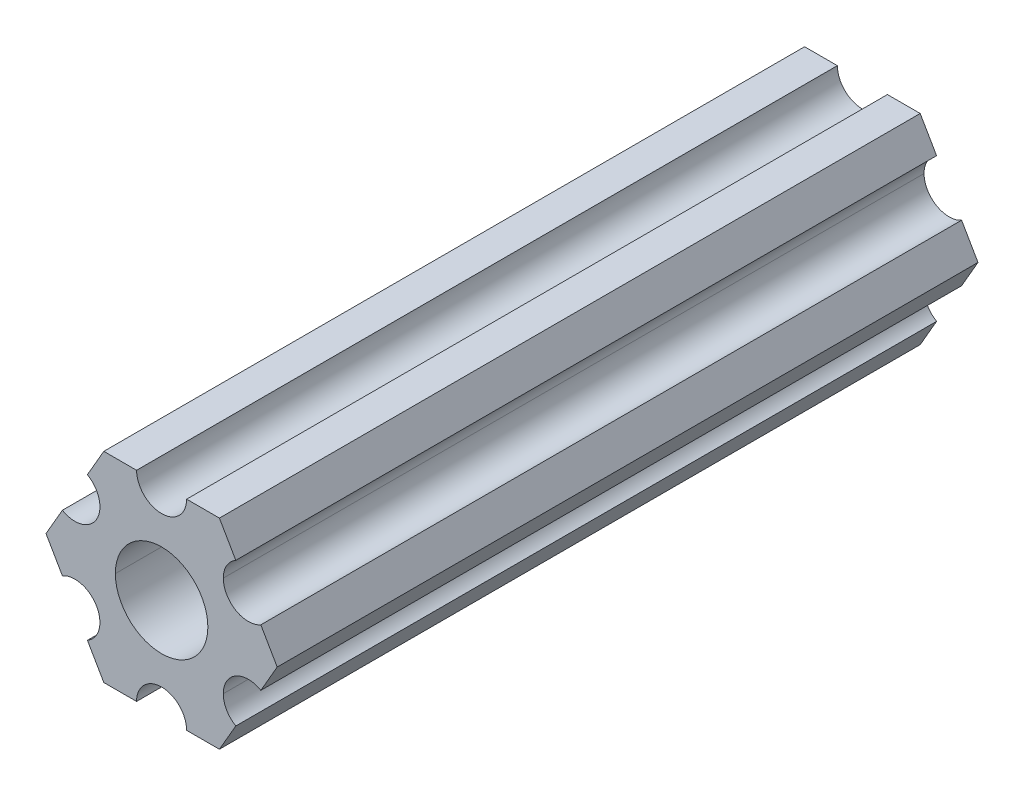
ISO-10303-21;
HEADER;
FILE_DESCRIPTION(('STEP AP214'),'2;1');
FILE_NAME('part.step','',(''),(''),'','','');
FILE_SCHEMA(('AUTOMOTIVE_DESIGN { 1 0 10303 214 1 1 1 1 }'));
ENDSEC;
DATA;
#1=APPLICATION_CONTEXT('core data for automotive mechanical design processes');
#2=APPLICATION_PROTOCOL_DEFINITION('international standard','automotive_design',2000,#1);
#3=PRODUCT_CONTEXT('',#1,'mechanical');
#4=PRODUCT('Part','Part','',(#3));
#5=PRODUCT_RELATED_PRODUCT_CATEGORY('part','',(#4));
#6=PRODUCT_DEFINITION_FORMATION('','',#4);
#7=PRODUCT_DEFINITION_CONTEXT('part definition',#1,'design');
#8=PRODUCT_DEFINITION('design','',#6,#7);
#9=PRODUCT_DEFINITION_SHAPE('','',#8);
#10=(LENGTH_UNIT() NAMED_UNIT(*) SI_UNIT(.MILLI.,.METRE.));
#11=(NAMED_UNIT(*) PLANE_ANGLE_UNIT() SI_UNIT($,.RADIAN.));
#12=(NAMED_UNIT(*) SI_UNIT($,.STERADIAN.) SOLID_ANGLE_UNIT());
#13=UNCERTAINTY_MEASURE_WITH_UNIT(LENGTH_MEASURE(1.E-05),#10,'distance_accuracy_value','');
#14=(GEOMETRIC_REPRESENTATION_CONTEXT(3) GLOBAL_UNCERTAINTY_ASSIGNED_CONTEXT((#13)) GLOBAL_UNIT_ASSIGNED_CONTEXT((#10,
#11,#12)) REPRESENTATION_CONTEXT('',''));
#15=CARTESIAN_POINT('',(0.,0.,0.));
#16=DIRECTION('',(0.,0.,1.));
#17=DIRECTION('',(1.,0.,0.));
#18=AXIS2_PLACEMENT_3D('',#15,#16,#17);
#19=CARTESIAN_POINT('',(6.29301142309098,-1.80018429024546,85.725));
#20=DIRECTION('',(-0.866025434075723,0.499999947533953,0.));
#21=DIRECTION('',(0.,0.,1.));
#22=AXIS2_PLACEMENT_3D('',#19,#20,#21);
#23=PLANE('',#22);
#24=DIRECTION('',(0.499999947533953,0.866025434075723,0.));
#25=VECTOR('',#24,1.);
#26=CARTESIAN_POINT('',(6.29301142309098,-1.80018429024546,44.45));
#27=LINE('',#26,#25);
#28=CARTESIAN_POINT('',(6.29301142309098,-1.80018429024546,44.45));
#29=VERTEX_POINT('',#28);
#30=CARTESIAN_POINT('',(7.33234841870826,4.44212519415746E-07,44.45));
#31=VERTEX_POINT('',#30);
#32=EDGE_CURVE('E398',#29,#31,#27,.T.);
#33=ORIENTED_EDGE('',*,*,#32,.F.);
#34=DIRECTION('',(0.,0.,-1.));
#35=VECTOR('',#34,1.);
#36=CARTESIAN_POINT('',(6.29301142309098,-1.80018429024546,85.725));
#37=LINE('',#36,#35);
#38=CARTESIAN_POINT('',(6.29301142309098,-1.80018429024546,0.));
#39=VERTEX_POINT('',#38);
#40=EDGE_CURVE('E270',#29,#39,#37,.T.);
#41=ORIENTED_EDGE('',*,*,#40,.T.);
#42=DIRECTION('',(0.499999947533953,0.866025434075723,0.));
#43=VECTOR('',#42,1.);
#44=CARTESIAN_POINT('',(6.29301142309098,-1.80018429024546,0.));
#45=LINE('',#44,#43);
#46=CARTESIAN_POINT('',(7.33234841870826,4.44212518961143E-07,0.));
#47=VERTEX_POINT('',#46);
#48=EDGE_CURVE('E292',#39,#47,#45,.T.);
#49=ORIENTED_EDGE('',*,*,#48,.T.);
#50=DIRECTION('',(0.,0.,1.));
#51=VECTOR('',#50,1.);
#52=CARTESIAN_POINT('',(7.33234841870827,4.44212519169686E-07,85.725));
#53=LINE('',#52,#51);
#54=EDGE_CURVE('E65',#47,#31,#53,.T.);
#55=ORIENTED_EDGE('',*,*,#54,.T.);
#56=EDGE_LOOP('',(#33,#41,#49,#55));
#57=FACE_BOUND('',#56,.T.);
#58=ADVANCED_FACE('F57',(#57),#23,.F.);
#59=CARTESIAN_POINT('',(7.33234841870827,4.44212519169686E-07,85.725));
#60=DIRECTION('',(-0.866025373493145,-0.500000052466057,0.));
#61=DIRECTION('',(-0.500000052466057,0.866025373493145,0.));
#62=AXIS2_PLACEMENT_3D('',#59,#60,#61);
#63=PLANE('',#62);
#64=DIRECTION('',(-0.500000052466057,0.866025373493145,0.));
#65=VECTOR('',#64,1.);
#66=CARTESIAN_POINT('',(7.33234841870827,4.44212519169686E-07,44.45));
#67=LINE('',#66,#65);
#68=CARTESIAN_POINT('',(6.29301120497139,1.80018505273895,44.45));
#69=VERTEX_POINT('',#68);
#70=EDGE_CURVE('E406',#31,#69,#67,.T.);
#71=ORIENTED_EDGE('',*,*,#70,.F.);
#72=ORIENTED_EDGE('',*,*,#54,.F.);
#73=DIRECTION('',(-0.500000052466057,0.866025373493145,0.));
#74=VECTOR('',#73,1.);
#75=CARTESIAN_POINT('',(7.33234841870827,4.44212519198906E-07,0.));
#76=LINE('',#75,#74);
#77=CARTESIAN_POINT('',(6.29301120497139,1.80018505273894,0.));
#78=VERTEX_POINT('',#77);
#79=EDGE_CURVE('E288',#47,#78,#76,.T.);
#80=ORIENTED_EDGE('',*,*,#79,.T.);
#81=DIRECTION('',(0.,0.,1.));
#82=VECTOR('',#81,1.);
#83=CARTESIAN_POINT('',(6.29301120497139,1.80018505273894,85.725));
#84=LINE('',#83,#82);
#85=EDGE_CURVE('E390',#78,#69,#84,.T.);
#86=ORIENTED_EDGE('',*,*,#85,.T.);
#87=EDGE_LOOP('',(#71,#72,#80,#86));
#88=FACE_BOUND('',#87,.T.);
#89=ADVANCED_FACE('F404',(#88),#63,.F.);
#90=CARTESIAN_POINT('',(5.49926112168156,3.17500033315934,85.725));
#91=DIRECTION('',(0.,0.,-1.));
#92=DIRECTION('',(-1.,0.,0.));
#93=AXIS2_PLACEMENT_3D('',#90,#91,#92);
#94=CYLINDRICAL_SURFACE('',#93,1.5875);
#95=CARTESIAN_POINT('',(5.49926112168156,3.17500033315934,44.45));
#96=DIRECTION('',(0.,0.,1.));
#97=DIRECTION('',(1.,0.,0.));
#98=AXIS2_PLACEMENT_3D('',#95,#96,#97);
#99=CIRCLE('',#98,1.5875);
#100=CARTESIAN_POINT('',(3.91176112168156,3.17500033315934,44.45));
#101=VERTEX_POINT('',#100);
#102=EDGE_CURVE('E409',#69,#101,#99,.F.);
#103=ORIENTED_EDGE('',*,*,#102,.F.);
#104=ORIENTED_EDGE('',*,*,#85,.F.);
#105=CARTESIAN_POINT('',(5.49926112168156,3.17500033315934,0.));
#106=DIRECTION('',(0.,0.,-1.));
#107=DIRECTION('',(-1.,0.,0.));
#108=AXIS2_PLACEMENT_3D('',#105,#106,#107);
#109=CIRCLE('',#108,1.5875);
#110=CARTESIAN_POINT('',(3.91176112168156,3.17500033315934,0.));
#111=VERTEX_POINT('',#110);
#112=EDGE_CURVE('E262',#78,#111,#109,.T.);
#113=ORIENTED_EDGE('',*,*,#112,.T.);
#114=DIRECTION('',(0.,0.,-1.));
#115=VECTOR('',#114,1.);
#116=CARTESIAN_POINT('',(3.91176112168156,3.17500033315934,85.725));
#117=LINE('',#116,#115);
#118=EDGE_CURVE('E273',#101,#111,#117,.T.);
#119=ORIENTED_EDGE('',*,*,#118,.F.);
#120=EDGE_LOOP('',(#103,#104,#113,#119));
#121=FACE_BOUND('',#120,.T.);
#122=ADVANCED_FACE('F869',(#121),#94,.F.);
#123=CARTESIAN_POINT('',(4.70551103839172,4.54981561357972,85.725));
#124=DIRECTION('',(-0.866025373493151,-0.500000052466046,0.));
#125=DIRECTION('',(-0.500000052466046,0.866025373493151,0.));
#126=AXIS2_PLACEMENT_3D('',#123,#124,#125);
#127=PLANE('',#126);
#128=DIRECTION('',(-0.500000052466046,0.866025373493151,0.));
#129=VECTOR('',#128,1.);
#130=CARTESIAN_POINT('',(4.70551103839172,4.54981561357972,44.45));
#131=LINE('',#130,#129);
#132=CARTESIAN_POINT('',(4.70551103839172,4.54981561357972,44.45));
#133=VERTEX_POINT('',#132);
#134=CARTESIAN_POINT('',(3.66617382465481,6.35000022210627,44.45));
#135=VERTEX_POINT('',#134);
#136=EDGE_CURVE('E479',#133,#135,#131,.T.);
#137=ORIENTED_EDGE('',*,*,#136,.F.);
#138=DIRECTION('',(0.,0.,1.));
#139=VECTOR('',#138,1.);
#140=CARTESIAN_POINT('',(4.70551103839172,4.54981561357972,85.725));
#141=LINE('',#140,#139);
#142=CARTESIAN_POINT('',(4.70551103839172,4.54981561357972,0.));
#143=VERTEX_POINT('',#142);
#144=EDGE_CURVE('E281',#143,#133,#141,.T.);
#145=ORIENTED_EDGE('',*,*,#144,.F.);
#146=DIRECTION('',(-0.500000052466046,0.866025373493151,0.));
#147=VECTOR('',#146,1.);
#148=CARTESIAN_POINT('',(4.70551103839172,4.54981561357972,0.));
#149=LINE('',#148,#147);
#150=CARTESIAN_POINT('',(3.66617382465481,6.35000022210627,0.));
#151=VERTEX_POINT('',#150);
#152=EDGE_CURVE('E259',#143,#151,#149,.T.);
#153=ORIENTED_EDGE('',*,*,#152,.T.);
#154=DIRECTION('',(0.,0.,1.));
#155=VECTOR('',#154,1.);
#156=CARTESIAN_POINT('',(3.66617382465481,6.35000022210627,85.725));
#157=LINE('',#156,#155);
#158=EDGE_CURVE('E386',#151,#135,#157,.T.);
#159=ORIENTED_EDGE('',*,*,#158,.T.);
#160=EDGE_LOOP('',(#137,#145,#153,#159));
#161=FACE_BOUND('',#160,.T.);
#162=ADVANCED_FACE('F491',(#161),#127,.F.);
#163=CARTESIAN_POINT('',(3.66617382465481,6.35000022210627,85.725));
#164=DIRECTION('',(6.05825850611185E-08,-1.,0.));
#165=DIRECTION('',(0.,0.,-1.));
#166=AXIS2_PLACEMENT_3D('',#163,#164,#165);
#167=PLANE('',#166);
#168=DIRECTION('',(-0.999999999999998,-6.05825850611184E-08,0.));
#169=VECTOR('',#168,1.);
#170=CARTESIAN_POINT('',(3.66617382465481,6.35000022210627,44.45));
#171=LINE('',#170,#169);
#172=CARTESIAN_POINT('',(1.58749961530074,6.35,44.45));
#173=VERTEX_POINT('',#172);
#174=EDGE_CURVE('E476',#135,#173,#171,.T.);
#175=ORIENTED_EDGE('',*,*,#174,.F.);
#176=ORIENTED_EDGE('',*,*,#158,.F.);
#177=DIRECTION('',(-1.,0.,0.));
#178=VECTOR('',#177,1.);
#179=CARTESIAN_POINT('',(5.49926112168156,6.35000022210627,0.));
#180=LINE('',#179,#178);
#181=CARTESIAN_POINT('',(1.58749961530073,6.35000015914054,0.));
#182=VERTEX_POINT('',#181);
#183=EDGE_CURVE('E263',#151,#182,#180,.T.);
#184=ORIENTED_EDGE('',*,*,#183,.T.);
#185=DIRECTION('',(0.,0.,1.));
#186=VECTOR('',#185,1.);
#187=CARTESIAN_POINT('',(1.58749961530074,6.35000009617482,85.725));
#188=LINE('',#187,#186);
#189=EDGE_CURVE('E303',#182,#173,#188,.T.);
#190=ORIENTED_EDGE('',*,*,#189,.T.);
#191=EDGE_LOOP('',(#175,#176,#184,#190));
#192=FACE_BOUND('',#191,.T.);
#193=ADVANCED_FACE('F498',(#192),#167,.F.);
#194=CARTESIAN_POINT('',(-3.84699260060323E-07,6.35,85.725));
#195=DIRECTION('',(0.,0.,-1.));
#196=DIRECTION('',(-1.,0.,0.));
#197=AXIS2_PLACEMENT_3D('',#194,#195,#196);
#198=CYLINDRICAL_SURFACE('',#197,1.5875);
#199=CARTESIAN_POINT('',(-3.84699260060323E-07,6.35,44.45));
#200=DIRECTION('',(0.,0.,1.));
#201=DIRECTION('',(1.,0.,0.));
#202=AXIS2_PLACEMENT_3D('',#199,#200,#201);
#203=CIRCLE('',#202,1.5875);
#204=CARTESIAN_POINT('',(-1.58750038469926,6.34999990382518,44.45));
#205=VERTEX_POINT('',#204);
#206=EDGE_CURVE('E473',#173,#205,#203,.F.);
#207=ORIENTED_EDGE('',*,*,#206,.F.);
#208=ORIENTED_EDGE('',*,*,#189,.F.);
#209=CARTESIAN_POINT('',(-3.84699260060323E-07,6.35,0.));
#210=DIRECTION('',(0.,0.,-1.));
#211=DIRECTION('',(-1.,0.,0.));
#212=AXIS2_PLACEMENT_3D('',#209,#210,#211);
#213=CIRCLE('',#212,1.5875);
#214=CARTESIAN_POINT('',(-1.58750038469926,6.34999990382519,0.));
#215=VERTEX_POINT('',#214);
#216=EDGE_CURVE('E329',#182,#215,#213,.T.);
#217=ORIENTED_EDGE('',*,*,#216,.T.);
#218=DIRECTION('',(0.,0.,1.));
#219=VECTOR('',#218,1.);
#220=CARTESIAN_POINT('',(-1.58750038469926,6.34999990382518,85.725));
#221=LINE('',#220,#219);
#222=EDGE_CURVE('E299',#215,#205,#221,.T.);
#223=ORIENTED_EDGE('',*,*,#222,.T.);
#224=EDGE_LOOP('',(#207,#208,#217,#223));
#225=FACE_BOUND('',#224,.T.);
#226=ADVANCED_FACE('F502',(#225),#198,.F.);
#227=CARTESIAN_POINT('',(-1.58750038469926,6.34999990382518,85.725));
#228=DIRECTION('',(6.05825963273174E-08,-1.,0.));
#229=DIRECTION('',(0.,0.,-1.));
#230=AXIS2_PLACEMENT_3D('',#227,#228,#229);
#231=PLANE('',#230);
#232=DIRECTION('',(-0.999999999999998,-6.05825963273173E-08,0.));
#233=VECTOR('',#232,1.);
#234=CARTESIAN_POINT('',(-1.58750038469926,6.34999990382518,44.45));
#235=LINE('',#234,#233);
#236=CARTESIAN_POINT('',(-3.66617454558244,6.34999986184803,44.45));
#237=VERTEX_POINT('',#236);
#238=EDGE_CURVE('E470',#205,#237,#235,.T.);
#239=ORIENTED_EDGE('',*,*,#238,.F.);
#240=ORIENTED_EDGE('',*,*,#222,.F.);
#241=DIRECTION('',(-1.,0.,0.));
#242=VECTOR('',#241,1.);
#243=CARTESIAN_POINT('',(5.49926112168156,6.34999990382519,0.));
#244=LINE('',#243,#242);
#245=CARTESIAN_POINT('',(-3.66617454558244,6.34999986184803,0.));
#246=VERTEX_POINT('',#245);
#247=EDGE_CURVE('E333',#215,#246,#244,.T.);
#248=ORIENTED_EDGE('',*,*,#247,.T.);
#249=DIRECTION('',(0.,0.,1.));
#250=VECTOR('',#249,1.);
#251=CARTESIAN_POINT('',(-3.66617459405349,6.3499997778937,85.725));
#252=LINE('',#251,#250);
#253=EDGE_CURVE('E286',#246,#237,#252,.T.);
#254=ORIENTED_EDGE('',*,*,#253,.T.);
#255=EDGE_LOOP('',(#239,#240,#248,#254));
#256=FACE_BOUND('',#255,.T.);
#257=ADVANCED_FACE('F504',(#256),#231,.F.);
#258=CARTESIAN_POINT('',(-3.66617459405349,6.3499997778937,85.725));
#259=DIRECTION('',(0.866025434075729,-0.499999947533942,0.));
#260=DIRECTION('',(0.,0.,-1.));
#261=AXIS2_PLACEMENT_3D('',#258,#259,#260);
#262=PLANE('',#261);
#263=DIRECTION('',(-0.499999947533942,-0.866025434075729,0.));
#264=VECTOR('',#263,1.);
#265=CARTESIAN_POINT('',(-3.66617459405349,6.3499997778937,44.45));
#266=LINE('',#265,#264);
#267=CARTESIAN_POINT('',(-4.70551158967065,4.54981504343587,44.45));
#268=VERTEX_POINT('',#267);
#269=EDGE_CURVE('E467',#237,#268,#266,.T.);
#270=ORIENTED_EDGE('',*,*,#269,.F.);
#271=ORIENTED_EDGE('',*,*,#253,.F.);
#272=DIRECTION('',(-0.499999947533943,-0.866025434075729,0.));
#273=VECTOR('',#272,1.);
#274=CARTESIAN_POINT('',(-3.66617459405349,6.3499997778937,0.));
#275=LINE('',#274,#273);
#276=CARTESIAN_POINT('',(-4.70551158967065,4.54981504343587,0.));
#277=VERTEX_POINT('',#276);
#278=EDGE_CURVE('E345',#246,#277,#275,.T.);
#279=ORIENTED_EDGE('',*,*,#278,.T.);
#280=DIRECTION('',(0.,0.,1.));
#281=VECTOR('',#280,1.);
#282=CARTESIAN_POINT('',(-4.70551158967065,4.54981504343587,85.725));
#283=LINE('',#282,#281);
#284=EDGE_CURVE('E282',#277,#268,#283,.T.);
#285=ORIENTED_EDGE('',*,*,#284,.T.);
#286=EDGE_LOOP('',(#270,#271,#279,#285));
#287=FACE_BOUND('',#286,.T.);
#288=ADVANCED_FACE('F509',(#287),#262,.F.);
#289=CARTESIAN_POINT('',(-5.49926150638082,3.17499966684067,85.725));
#290=DIRECTION('',(0.,0.,-1.));
#291=DIRECTION('',(-1.,0.,0.));
#292=AXIS2_PLACEMENT_3D('',#289,#290,#291);
#293=CYLINDRICAL_SURFACE('',#292,1.5875);
#294=CARTESIAN_POINT('',(-5.49926150638082,3.17499966684067,44.45));
#295=DIRECTION('',(0.,0.,1.));
#296=DIRECTION('',(1.,0.,0.));
#297=AXIS2_PLACEMENT_3D('',#294,#295,#296);
#298=CIRCLE('',#297,1.5875);
#299=CARTESIAN_POINT('',(-6.29301142309098,1.80018429024547,44.45));
#300=VERTEX_POINT('',#299);
#301=EDGE_CURVE('E464',#268,#300,#298,.F.);
#302=ORIENTED_EDGE('',*,*,#301,.F.);
#303=ORIENTED_EDGE('',*,*,#284,.F.);
#304=CARTESIAN_POINT('',(-5.49926150638082,3.17499966684067,0.));
#305=DIRECTION('',(0.,0.,-1.));
#306=DIRECTION('',(-1.,0.,0.));
#307=AXIS2_PLACEMENT_3D('',#304,#305,#306);
#308=CIRCLE('',#307,1.5875);
#309=CARTESIAN_POINT('',(-6.29301142309098,1.80018429024547,0.));
#310=VERTEX_POINT('',#309);
#311=EDGE_CURVE('E341',#277,#310,#308,.T.);
#312=ORIENTED_EDGE('',*,*,#311,.T.);
#313=DIRECTION('',(0.,0.,1.));
#314=VECTOR('',#313,1.);
#315=CARTESIAN_POINT('',(-6.29301142309098,1.80018429024547,85.725));
#316=LINE('',#315,#314);
#317=EDGE_CURVE('E287',#310,#300,#316,.T.);
#318=ORIENTED_EDGE('',*,*,#317,.T.);
#319=EDGE_LOOP('',(#302,#303,#312,#318));
#320=FACE_BOUND('',#319,.T.);
#321=ADVANCED_FACE('F512',(#320),#293,.F.);
#322=CARTESIAN_POINT('',(-6.29301142309098,1.80018429024547,85.725));
#323=DIRECTION('',(0.866025434075724,-0.499999947533952,0.));
#324=DIRECTION('',(0.,0.,-1.));
#325=AXIS2_PLACEMENT_3D('',#322,#323,#324);
#326=PLANE('',#325);
#327=DIRECTION('',(-0.499999947533952,-0.866025434075724,0.));
#328=VECTOR('',#327,1.);
#329=CARTESIAN_POINT('',(-6.29301142309098,1.80018429024547,44.45));
#330=LINE('',#329,#328);
#331=CARTESIAN_POINT('',(-7.33234841870827,-4.44212524036369E-07,44.45));
#332=VERTEX_POINT('',#331);
#333=EDGE_CURVE('E461',#300,#332,#330,.T.);
#334=ORIENTED_EDGE('',*,*,#333,.F.);
#335=ORIENTED_EDGE('',*,*,#317,.F.);
#336=DIRECTION('',(-0.499999947533952,-0.866025434075724,0.));
#337=VECTOR('',#336,1.);
#338=CARTESIAN_POINT('',(-6.29301142309098,1.80018429024547,0.));
#339=LINE('',#338,#337);
#340=CARTESIAN_POINT('',(-7.33234841870826,-4.44212524036367E-07,0.));
#341=VERTEX_POINT('',#340);
#342=EDGE_CURVE('E337',#310,#341,#339,.T.);
#343=ORIENTED_EDGE('',*,*,#342,.T.);
#344=DIRECTION('',(0.,0.,1.));
#345=VECTOR('',#344,1.);
#346=CARTESIAN_POINT('',(-7.33234841870827,-4.44212523790841E-07,85.725));
#347=LINE('',#346,#345);
#348=EDGE_CURVE('E269',#341,#332,#347,.T.);
#349=ORIENTED_EDGE('',*,*,#348,.T.);
#350=EDGE_LOOP('',(#334,#335,#343,#349));
#351=FACE_BOUND('',#350,.T.);
#352=ADVANCED_FACE('F517',(#351),#326,.F.);
#353=CARTESIAN_POINT('',(-7.33234841870827,-4.44212523790841E-07,85.725));
#354=DIRECTION('',(0.866025373493151,0.500000052466045,0.));
#355=DIRECTION('',(0.,0.,-1.));
#356=AXIS2_PLACEMENT_3D('',#353,#354,#355);
#357=PLANE('',#356);
#358=DIRECTION('',(0.500000052466045,-0.866025373493151,0.));
#359=VECTOR('',#358,1.);
#360=CARTESIAN_POINT('',(-7.33234841870827,-4.44212523790841E-07,44.45));
#361=LINE('',#360,#359);
#362=CARTESIAN_POINT('',(-6.29301120497141,-1.80018505273896,44.45));
#363=VERTEX_POINT('',#362);
#364=EDGE_CURVE('E458',#332,#363,#361,.T.);
#365=ORIENTED_EDGE('',*,*,#364,.F.);
#366=ORIENTED_EDGE('',*,*,#348,.F.);
#367=DIRECTION('',(0.500000052466045,-0.866025373493151,0.));
#368=VECTOR('',#367,1.);
#369=CARTESIAN_POINT('',(-7.33234841870827,-4.44212523969395E-07,0.));
#370=LINE('',#369,#368);
#371=CARTESIAN_POINT('',(-6.29301120497141,-1.80018505273897,0.));
#372=VERTEX_POINT('',#371);
#373=EDGE_CURVE('E308',#341,#372,#370,.T.);
#374=ORIENTED_EDGE('',*,*,#373,.T.);
#375=DIRECTION('',(0.,0.,1.));
#376=VECTOR('',#375,1.);
#377=CARTESIAN_POINT('',(-6.29301120497141,-1.80018505273897,85.725));
#378=LINE('',#377,#376);
#379=EDGE_CURVE('E265',#372,#363,#378,.T.);
#380=ORIENTED_EDGE('',*,*,#379,.T.);
#381=EDGE_LOOP('',(#365,#366,#374,#380));
#382=FACE_BOUND('',#381,.T.);
#383=ADVANCED_FACE('F520',(#382),#357,.F.);
#384=CARTESIAN_POINT('',(-5.49926112168156,-3.17500033315934,85.725));
#385=DIRECTION('',(0.,0.,-1.));
#386=DIRECTION('',(-1.,0.,0.));
#387=AXIS2_PLACEMENT_3D('',#384,#385,#386);
#388=CYLINDRICAL_SURFACE('',#387,1.5875);
#389=CARTESIAN_POINT('',(-5.49926112168156,-3.17500033315934,44.45));
#390=DIRECTION('',(0.,0.,1.));
#391=DIRECTION('',(1.,0.,0.));
#392=AXIS2_PLACEMENT_3D('',#389,#390,#391);
#393=CIRCLE('',#392,1.5875);
#394=CARTESIAN_POINT('',(-4.70551103839172,-4.54981561357972,44.45));
#395=VERTEX_POINT('',#394);
#396=EDGE_CURVE('E455',#363,#395,#393,.F.);
#397=ORIENTED_EDGE('',*,*,#396,.F.);
#398=ORIENTED_EDGE('',*,*,#379,.F.);
#399=CARTESIAN_POINT('',(-5.49926112168156,-3.17500033315934,0.));
#400=DIRECTION('',(0.,0.,-1.));
#401=DIRECTION('',(-1.,0.,0.));
#402=AXIS2_PLACEMENT_3D('',#399,#400,#401);
#403=CIRCLE('',#402,1.5875);
#404=CARTESIAN_POINT('',(-4.70551103839172,-4.54981561357972,0.));
#405=VERTEX_POINT('',#404);
#406=EDGE_CURVE('E304',#372,#405,#403,.T.);
#407=ORIENTED_EDGE('',*,*,#406,.T.);
#408=DIRECTION('',(0.,0.,1.));
#409=VECTOR('',#408,1.);
#410=CARTESIAN_POINT('',(-4.70551103839172,-4.54981561357972,85.725));
#411=LINE('',#410,#409);
#412=EDGE_CURVE('E252',#405,#395,#411,.T.);
#413=ORIENTED_EDGE('',*,*,#412,.T.);
#414=EDGE_LOOP('',(#397,#398,#407,#413));
#415=FACE_BOUND('',#414,.T.);
#416=ADVANCED_FACE('F526',(#415),#388,.F.);
#417=CARTESIAN_POINT('',(-4.70551103839172,-4.54981561357972,85.725));
#418=DIRECTION('',(0.866025373493152,0.500000052466045,0.));
#419=DIRECTION('',(0.,0.,-1.));
#420=AXIS2_PLACEMENT_3D('',#417,#418,#419);
#421=PLANE('',#420);
#422=DIRECTION('',(0.500000052466045,-0.866025373493152,0.));
#423=VECTOR('',#422,1.);
#424=CARTESIAN_POINT('',(-4.70551103839172,-4.54981561357972,44.45));
#425=LINE('',#424,#423);
#426=CARTESIAN_POINT('',(-3.66617382465481,-6.35000022210628,44.45));
#427=VERTEX_POINT('',#426);
#428=EDGE_CURVE('E452',#395,#427,#425,.T.);
#429=ORIENTED_EDGE('',*,*,#428,.F.);
#430=ORIENTED_EDGE('',*,*,#412,.F.);
#431=DIRECTION('',(0.500000052466045,-0.866025373493151,0.));
#432=VECTOR('',#431,1.);
#433=CARTESIAN_POINT('',(-4.70551103839172,-4.54981561357972,0.));
#434=LINE('',#433,#432);
#435=CARTESIAN_POINT('',(-3.66617382465481,-6.35000022210628,0.));
#436=VERTEX_POINT('',#435);
#437=EDGE_CURVE('E309',#405,#436,#434,.T.);
#438=ORIENTED_EDGE('',*,*,#437,.T.);
#439=DIRECTION('',(0.,0.,1.));
#440=VECTOR('',#439,1.);
#441=CARTESIAN_POINT('',(-3.66617382465481,-6.35000022210628,85.725));
#442=LINE('',#441,#440);
#443=EDGE_CURVE('E370',#436,#427,#442,.T.);
#444=ORIENTED_EDGE('',*,*,#443,.T.);
#445=EDGE_LOOP('',(#429,#430,#438,#444));
#446=FACE_BOUND('',#445,.T.);
#447=ADVANCED_FACE('F807',(#446),#421,.F.);
#448=CARTESIAN_POINT('',(-3.66617382465481,-6.35000022210628,85.725));
#449=DIRECTION('',(-6.05825854783851E-08,1.,0.));
#450=DIRECTION('',(0.,0.,1.));
#451=AXIS2_PLACEMENT_3D('',#448,#449,#450);
#452=PLANE('',#451);
#453=DIRECTION('',(0.999999999999998,6.0582585478385E-08,0.));
#454=VECTOR('',#453,1.);
#455=CARTESIAN_POINT('',(-3.66617382465481,-6.35000022210628,44.45));
#456=LINE('',#455,#454);
#457=CARTESIAN_POINT('',(-1.58749961530073,-6.35000011105314,44.45));
#458=VERTEX_POINT('',#457);
#459=EDGE_CURVE('E449',#427,#458,#456,.T.);
#460=ORIENTED_EDGE('',*,*,#459,.F.);
#461=ORIENTED_EDGE('',*,*,#443,.F.);
#462=DIRECTION('',(1.,0.,0.));
#463=VECTOR('',#462,1.);
#464=CARTESIAN_POINT('',(5.49926112168156,-6.35000022210628,0.));
#465=LINE('',#464,#463);
#466=CARTESIAN_POINT('',(-1.58749961530073,-6.35000011105314,0.));
#467=VERTEX_POINT('',#466);
#468=EDGE_CURVE('E322',#436,#467,#465,.T.);
#469=ORIENTED_EDGE('',*,*,#468,.T.);
#470=DIRECTION('',(0.,0.,1.));
#471=VECTOR('',#470,1.);
#472=CARTESIAN_POINT('',(-1.58749961530074,-6.35,85.725));
#473=LINE('',#472,#471);
#474=EDGE_CURVE('E369',#467,#458,#473,.T.);
#475=ORIENTED_EDGE('',*,*,#474,.T.);
#476=EDGE_LOOP('',(#460,#461,#469,#475));
#477=FACE_BOUND('',#476,.T.);
#478=ADVANCED_FACE('F799',(#477),#452,.F.);
#479=CARTESIAN_POINT('',(3.8469926204343E-07,-6.35,85.725));
#480=DIRECTION('',(0.,0.,-1.));
#481=DIRECTION('',(-1.,0.,0.));
#482=AXIS2_PLACEMENT_3D('',#479,#480,#481);
#483=CYLINDRICAL_SURFACE('',#482,1.5875);
#484=CARTESIAN_POINT('',(3.8469926204343E-07,-6.35,44.45));
#485=DIRECTION('',(0.,0.,1.));
#486=DIRECTION('',(1.,0.,0.));
#487=AXIS2_PLACEMENT_3D('',#484,#485,#486);
#488=CIRCLE('',#487,1.5875);
#489=CARTESIAN_POINT('',(1.58750038469926,-6.34999990382518,44.45));
#490=VERTEX_POINT('',#489);
#491=EDGE_CURVE('E446',#458,#490,#488,.F.);
#492=ORIENTED_EDGE('',*,*,#491,.F.);
#493=ORIENTED_EDGE('',*,*,#474,.F.);
#494=CARTESIAN_POINT('',(3.8469926204343E-07,-6.35,0.));
#495=DIRECTION('',(0.,0.,-1.));
#496=DIRECTION('',(-1.,0.,0.));
#497=AXIS2_PLACEMENT_3D('',#494,#495,#496);
#498=CIRCLE('',#497,1.5875);
#499=CARTESIAN_POINT('',(1.58750038469926,-6.34999990382519,0.));
#500=VERTEX_POINT('',#499);
#501=EDGE_CURVE('E257',#467,#500,#498,.T.);
#502=ORIENTED_EDGE('',*,*,#501,.T.);
#503=DIRECTION('',(0.,0.,1.));
#504=VECTOR('',#503,1.);
#505=CARTESIAN_POINT('',(1.58750038469926,-6.34999990382518,85.725));
#506=LINE('',#505,#504);
#507=EDGE_CURVE('E314',#500,#490,#506,.T.);
#508=ORIENTED_EDGE('',*,*,#507,.T.);
#509=EDGE_LOOP('',(#492,#493,#502,#508));
#510=FACE_BOUND('',#509,.T.);
#511=ADVANCED_FACE('F791',(#510),#483,.F.);
#512=CARTESIAN_POINT('',(1.58750038469926,-6.34999990382518,85.725));
#513=DIRECTION('',(-6.05825721258438E-08,1.,0.));
#514=DIRECTION('',(0.,0.,1.));
#515=AXIS2_PLACEMENT_3D('',#512,#513,#514);
#516=PLANE('',#515);
#517=DIRECTION('',(0.999999999999998,6.05825721258437E-08,0.));
#518=VECTOR('',#517,1.);
#519=CARTESIAN_POINT('',(1.58750038469926,-6.34999990382518,44.45));
#520=LINE('',#519,#518);
#521=CARTESIAN_POINT('',(3.66617454558243,-6.34999986184804,44.45));
#522=VERTEX_POINT('',#521);
#523=EDGE_CURVE('E443',#490,#522,#520,.T.);
#524=ORIENTED_EDGE('',*,*,#523,.F.);
#525=ORIENTED_EDGE('',*,*,#507,.F.);
#526=DIRECTION('',(1.,0.,0.));
#527=VECTOR('',#526,1.);
#528=CARTESIAN_POINT('',(5.49926112168156,-6.34999990382519,0.));
#529=LINE('',#528,#527);
#530=CARTESIAN_POINT('',(3.66617454558244,-6.34999986184804,0.));
#531=VERTEX_POINT('',#530);
#532=EDGE_CURVE('E253',#500,#531,#529,.T.);
#533=ORIENTED_EDGE('',*,*,#532,.T.);
#534=DIRECTION('',(0.,0.,1.));
#535=VECTOR('',#534,1.);
#536=CARTESIAN_POINT('',(3.66617459405346,-6.34999977789375,85.725));
#537=LINE('',#536,#535);
#538=EDGE_CURVE('E310',#531,#522,#537,.T.);
#539=ORIENTED_EDGE('',*,*,#538,.T.);
#540=EDGE_LOOP('',(#524,#525,#533,#539));
#541=FACE_BOUND('',#540,.T.);
#542=ADVANCED_FACE('F783',(#541),#516,.F.);
#543=CARTESIAN_POINT('',(3.66617459405346,-6.34999977789375,85.725));
#544=DIRECTION('',(-0.86602543407573,0.499999947533941,0.));
#545=DIRECTION('',(0.,0.,1.));
#546=AXIS2_PLACEMENT_3D('',#543,#544,#545);
#547=PLANE('',#546);
#548=DIRECTION('',(0.499999947533941,0.86602543407573,0.));
#549=VECTOR('',#548,1.);
#550=CARTESIAN_POINT('',(3.66617459405346,-6.34999977789375,44.45));
#551=LINE('',#550,#549);
#552=CARTESIAN_POINT('',(4.70551158967065,-4.54981504343587,44.45));
#553=VERTEX_POINT('',#552);
#554=EDGE_CURVE('E438',#522,#553,#551,.T.);
#555=ORIENTED_EDGE('',*,*,#554,.F.);
#556=ORIENTED_EDGE('',*,*,#538,.F.);
#557=DIRECTION('',(0.49999994753394,0.86602543407573,0.));
#558=VECTOR('',#557,1.);
#559=CARTESIAN_POINT('',(3.66617459405346,-6.34999977789376,0.));
#560=LINE('',#559,#558);
#561=CARTESIAN_POINT('',(4.70551158967065,-4.54981504343587,0.));
#562=VERTEX_POINT('',#561);
#563=EDGE_CURVE('E258',#531,#562,#560,.T.);
#564=ORIENTED_EDGE('',*,*,#563,.T.);
#565=DIRECTION('',(0.,0.,-1.));
#566=VECTOR('',#565,1.);
#567=CARTESIAN_POINT('',(4.70551158967065,-4.54981504343587,85.725));
#568=LINE('',#567,#566);
#569=EDGE_CURVE('E315',#553,#562,#568,.T.);
#570=ORIENTED_EDGE('',*,*,#569,.F.);
#571=EDGE_LOOP('',(#555,#556,#564,#570));
#572=FACE_BOUND('',#571,.T.);
#573=ADVANCED_FACE('F777',(#572),#547,.F.);
#574=CARTESIAN_POINT('',(5.49926150638082,-3.17499966684067,85.725));
#575=DIRECTION('',(0.,0.,-1.));
#576=DIRECTION('',(-1.,0.,0.));
#577=AXIS2_PLACEMENT_3D('',#574,#575,#576);
#578=CYLINDRICAL_SURFACE('',#577,1.5875);
#579=CARTESIAN_POINT('',(5.49926150638082,-3.17499966684067,44.45));
#580=DIRECTION('',(0.,0.,1.));
#581=DIRECTION('',(1.,0.,0.));
#582=AXIS2_PLACEMENT_3D('',#579,#580,#581);
#583=CIRCLE('',#582,1.5875);
#584=CARTESIAN_POINT('',(3.91176150638082,-3.17499966684067,44.45));
#585=VERTEX_POINT('',#584);
#586=EDGE_CURVE('E72',#553,#585,#583,.F.);
#587=ORIENTED_EDGE('',*,*,#586,.F.);
#588=ORIENTED_EDGE('',*,*,#569,.T.);
#589=CARTESIAN_POINT('',(5.49926150638082,-3.17499966684067,0.));
#590=DIRECTION('',(0.,0.,-1.));
#591=DIRECTION('',(-1.,0.,0.));
#592=AXIS2_PLACEMENT_3D('',#589,#590,#591);
#593=CIRCLE('',#592,1.5875);
#594=CARTESIAN_POINT('',(3.91176150638082,-3.17499966684067,0.));
#595=VERTEX_POINT('',#594);
#596=EDGE_CURVE('E280',#562,#595,#593,.T.);
#597=ORIENTED_EDGE('',*,*,#596,.T.);
#598=DIRECTION('',(0.,0.,-1.));
#599=VECTOR('',#598,1.);
#600=CARTESIAN_POINT('',(3.91176150638082,-3.17499966684067,85.725));
#601=LINE('',#600,#599);
#602=EDGE_CURVE('E242',#585,#595,#601,.T.);
#603=ORIENTED_EDGE('',*,*,#602,.F.);
#604=EDGE_LOOP('',(#587,#588,#597,#603));
#605=FACE_BOUND('',#604,.T.);
#606=ADVANCED_FACE('F428',(#605),#578,.F.);
#607=CARTESIAN_POINT('',(0.,0.,85.725));
#608=DIRECTION('',(0.,0.,-1.));
#609=DIRECTION('',(-1.,0.,0.));
#610=AXIS2_PLACEMENT_3D('',#607,#608,#609);
#611=CYLINDRICAL_SURFACE('',#610,2.9337);
#612=CARTESIAN_POINT('',(0.,0.,44.45));
#613=DIRECTION('',(0.,0.,1.));
#614=DIRECTION('',(1.,0.,0.));
#615=AXIS2_PLACEMENT_3D('',#612,#613,#614);
#616=CIRCLE('',#615,2.9337);
#617=CARTESIAN_POINT('',(-2.9337,0.,44.45));
#618=VERTEX_POINT('',#617);
#619=CARTESIAN_POINT('',(2.9337,0.,44.45));
#620=VERTEX_POINT('',#619);
#621=EDGE_CURVE('E78',#618,#620,#616,.F.);
#622=ORIENTED_EDGE('',*,*,#621,.F.);
#623=DIRECTION('',(0.,0.,-1.));
#624=VECTOR('',#623,1.);
#625=CARTESIAN_POINT('',(-2.9337,0.,85.725));
#626=LINE('',#625,#624);
#627=CARTESIAN_POINT('',(-2.9337,0.,0.));
#628=VERTEX_POINT('',#627);
#629=EDGE_CURVE('E231',#618,#628,#626,.T.);
#630=ORIENTED_EDGE('',*,*,#629,.T.);
#631=CARTESIAN_POINT('',(0.,0.,0.));
#632=DIRECTION('',(0.,0.,1.));
#633=DIRECTION('',(-1.,0.,0.));
#634=AXIS2_PLACEMENT_3D('',#631,#632,#633);
#635=CIRCLE('',#634,2.9337);
#636=CARTESIAN_POINT('',(2.9337,0.,0.));
#637=VERTEX_POINT('',#636);
#638=EDGE_CURVE('E277',#637,#628,#635,.T.);
#639=ORIENTED_EDGE('',*,*,#638,.F.);
#640=DIRECTION('',(0.,0.,-1.));
#641=VECTOR('',#640,1.);
#642=CARTESIAN_POINT('',(2.9337,0.,85.725));
#643=LINE('',#642,#641);
#644=EDGE_CURVE('E233',#620,#637,#643,.T.);
#645=ORIENTED_EDGE('',*,*,#644,.F.);
#646=EDGE_LOOP('',(#622,#630,#639,#645));
#647=FACE_BOUND('',#646,.T.);
#648=ADVANCED_FACE('F229',(#647),#611,.F.);
#649=CARTESIAN_POINT('',(5.49926112168156,3.17500033315934,85.725));
#650=DIRECTION('',(0.,0.,-1.));
#651=DIRECTION('',(-1.,0.,0.));
#652=AXIS2_PLACEMENT_3D('',#649,#650,#651);
#653=CYLINDRICAL_SURFACE('',#652,1.5875);
#654=CARTESIAN_POINT('',(5.49926112168156,3.17500033315934,44.45));
#655=DIRECTION('',(0.,0.,1.));
#656=DIRECTION('',(1.,0.,0.));
#657=AXIS2_PLACEMENT_3D('',#654,#655,#656);
#658=CIRCLE('',#657,1.5875);
#659=EDGE_CURVE('E414',#101,#133,#658,.F.);
#660=ORIENTED_EDGE('',*,*,#659,.F.);
#661=ORIENTED_EDGE('',*,*,#118,.T.);
#662=CARTESIAN_POINT('',(5.49926112168156,3.17500033315934,0.));
#663=DIRECTION('',(0.,0.,-1.));
#664=DIRECTION('',(-1.,0.,0.));
#665=AXIS2_PLACEMENT_3D('',#662,#663,#664);
#666=CIRCLE('',#665,1.5875);
#667=EDGE_CURVE('E276',#111,#143,#666,.T.);
#668=ORIENTED_EDGE('',*,*,#667,.T.);
#669=ORIENTED_EDGE('',*,*,#144,.T.);
#670=EDGE_LOOP('',(#660,#661,#668,#669));
#671=FACE_BOUND('',#670,.T.);
#672=ADVANCED_FACE('F492',(#671),#653,.F.);
#673=CARTESIAN_POINT('',(5.49926150638082,-3.17499966684067,85.725));
#674=DIRECTION('',(0.,0.,-1.));
#675=DIRECTION('',(-1.,0.,0.));
#676=AXIS2_PLACEMENT_3D('',#673,#674,#675);
#677=CYLINDRICAL_SURFACE('',#676,1.5875);
#678=CARTESIAN_POINT('',(5.49926150638082,-3.17499966684067,44.45));
#679=DIRECTION('',(0.,0.,1.));
#680=DIRECTION('',(1.,0.,0.));
#681=AXIS2_PLACEMENT_3D('',#678,#679,#680);
#682=CIRCLE('',#681,1.5875);
#683=EDGE_CURVE('E235',#585,#29,#682,.F.);
#684=ORIENTED_EDGE('',*,*,#683,.F.);
#685=ORIENTED_EDGE('',*,*,#602,.T.);
#686=CARTESIAN_POINT('',(5.49926150638082,-3.17499966684067,0.));
#687=DIRECTION('',(0.,0.,-1.));
#688=DIRECTION('',(-1.,0.,0.));
#689=AXIS2_PLACEMENT_3D('',#686,#687,#688);
#690=CIRCLE('',#689,1.5875);
#691=EDGE_CURVE('E247',#595,#39,#690,.T.);
#692=ORIENTED_EDGE('',*,*,#691,.T.);
#693=ORIENTED_EDGE('',*,*,#40,.F.);
#694=EDGE_LOOP('',(#684,#685,#692,#693));
#695=FACE_BOUND('',#694,.T.);
#696=ADVANCED_FACE('F434',(#695),#677,.F.);
#697=CARTESIAN_POINT('',(0.,0.,85.725));
#698=DIRECTION('',(0.,0.,-1.));
#699=DIRECTION('',(-1.,0.,0.));
#700=AXIS2_PLACEMENT_3D('',#697,#698,#699);
#701=CYLINDRICAL_SURFACE('',#700,2.9337);
#702=CARTESIAN_POINT('',(0.,0.,44.45));
#703=DIRECTION('',(0.,0.,1.));
#704=DIRECTION('',(1.,0.,0.));
#705=AXIS2_PLACEMENT_3D('',#702,#703,#704);
#706=CIRCLE('',#705,2.9337);
#707=EDGE_CURVE('E12',#620,#618,#706,.F.);
#708=ORIENTED_EDGE('',*,*,#707,.F.);
#709=ORIENTED_EDGE('',*,*,#644,.T.);
#710=CARTESIAN_POINT('',(0.,0.,0.));
#711=DIRECTION('',(0.,0.,1.));
#712=DIRECTION('',(-1.,0.,0.));
#713=AXIS2_PLACEMENT_3D('',#710,#711,#712);
#714=CIRCLE('',#713,2.9337);
#715=EDGE_CURVE('E240',#628,#637,#714,.T.);
#716=ORIENTED_EDGE('',*,*,#715,.F.);
#717=ORIENTED_EDGE('',*,*,#629,.F.);
#718=EDGE_LOOP('',(#708,#709,#716,#717));
#719=FACE_BOUND('',#718,.T.);
#720=ADVANCED_FACE('F238',(#719),#701,.F.);
#721=CARTESIAN_POINT('',(5.49926112168156,3.17500033315934,0.));
#722=DIRECTION('',(0.,0.,1.));
#723=DIRECTION('',(1.,0.,0.));
#724=AXIS2_PLACEMENT_3D('',#721,#722,#723);
#725=PLANE('',#724);
#726=ORIENTED_EDGE('',*,*,#715,.T.);
#727=ORIENTED_EDGE('',*,*,#638,.T.);
#728=EDGE_LOOP('',(#726,#727));
#729=FACE_BOUND('',#728,.T.);
#730=ORIENTED_EDGE('',*,*,#596,.F.);
#731=ORIENTED_EDGE('',*,*,#563,.F.);
#732=ORIENTED_EDGE('',*,*,#532,.F.);
#733=ORIENTED_EDGE('',*,*,#501,.F.);
#734=ORIENTED_EDGE('',*,*,#468,.F.);
#735=ORIENTED_EDGE('',*,*,#437,.F.);
#736=ORIENTED_EDGE('',*,*,#406,.F.);
#737=ORIENTED_EDGE('',*,*,#373,.F.);
#738=ORIENTED_EDGE('',*,*,#342,.F.);
#739=ORIENTED_EDGE('',*,*,#311,.F.);
#740=ORIENTED_EDGE('',*,*,#278,.F.);
#741=ORIENTED_EDGE('',*,*,#247,.F.);
#742=ORIENTED_EDGE('',*,*,#216,.F.);
#743=ORIENTED_EDGE('',*,*,#183,.F.);
#744=ORIENTED_EDGE('',*,*,#152,.F.);
#745=ORIENTED_EDGE('',*,*,#667,.F.);
#746=ORIENTED_EDGE('',*,*,#112,.F.);
#747=ORIENTED_EDGE('',*,*,#79,.F.);
#748=ORIENTED_EDGE('',*,*,#48,.F.);
#749=ORIENTED_EDGE('',*,*,#691,.F.);
#750=EDGE_LOOP('',(#730,#731,#732,#733,#734,#735,#736,#737,#738,#739,#740,#741,#742,#743,#744,
#745,#746,#747,#748,#749));
#751=FACE_BOUND('',#750,.T.);
#752=ADVANCED_FACE('F432',(#729,#751),#725,.F.);
#753=CARTESIAN_POINT('',(5.49926112168156,3.17500033315934,44.45));
#754=DIRECTION('',(0.,0.,1.));
#755=DIRECTION('',(1.,0.,0.));
#756=AXIS2_PLACEMENT_3D('',#753,#754,#755);
#757=PLANE('',#756);
#758=ORIENTED_EDGE('',*,*,#621,.T.);
#759=ORIENTED_EDGE('',*,*,#707,.T.);
#760=EDGE_LOOP('',(#758,#759));
#761=FACE_BOUND('',#760,.T.);
#762=ORIENTED_EDGE('',*,*,#70,.T.);
#763=ORIENTED_EDGE('',*,*,#102,.T.);
#764=ORIENTED_EDGE('',*,*,#659,.T.);
#765=ORIENTED_EDGE('',*,*,#136,.T.);
#766=ORIENTED_EDGE('',*,*,#174,.T.);
#767=ORIENTED_EDGE('',*,*,#206,.T.);
#768=ORIENTED_EDGE('',*,*,#238,.T.);
#769=ORIENTED_EDGE('',*,*,#269,.T.);
#770=ORIENTED_EDGE('',*,*,#301,.T.);
#771=ORIENTED_EDGE('',*,*,#333,.T.);
#772=ORIENTED_EDGE('',*,*,#364,.T.);
#773=ORIENTED_EDGE('',*,*,#396,.T.);
#774=ORIENTED_EDGE('',*,*,#428,.T.);
#775=ORIENTED_EDGE('',*,*,#459,.T.);
#776=ORIENTED_EDGE('',*,*,#491,.T.);
#777=ORIENTED_EDGE('',*,*,#523,.T.);
#778=ORIENTED_EDGE('',*,*,#554,.T.);
#779=ORIENTED_EDGE('',*,*,#586,.T.);
#780=ORIENTED_EDGE('',*,*,#683,.T.);
#781=ORIENTED_EDGE('',*,*,#32,.T.);
#782=EDGE_LOOP('',(#762,#763,#764,#765,#766,#767,#768,#769,#770,#771,#772,#773,#774,#775,#776,
#777,#778,#779,#780,#781));
#783=FACE_BOUND('',#782,.T.);
#784=ADVANCED_FACE('F224',(#761,#783),#757,.T.);
#785=CLOSED_SHELL('',(#58,#89,#122,#162,#193,#226,#257,#288,#321,#352,#383,#416,#447,#478,#511,
#542,#573,#606,#648,#672,#696,#720,#752,#784));
#786=MANIFOLD_SOLID_BREP('B2',#785);
#787=ADVANCED_BREP_SHAPE_REPRESENTATION('',(#18,#786),#14);
#788=SHAPE_DEFINITION_REPRESENTATION(#9,#787);
ENDSEC;
END-ISO-10303-21;
